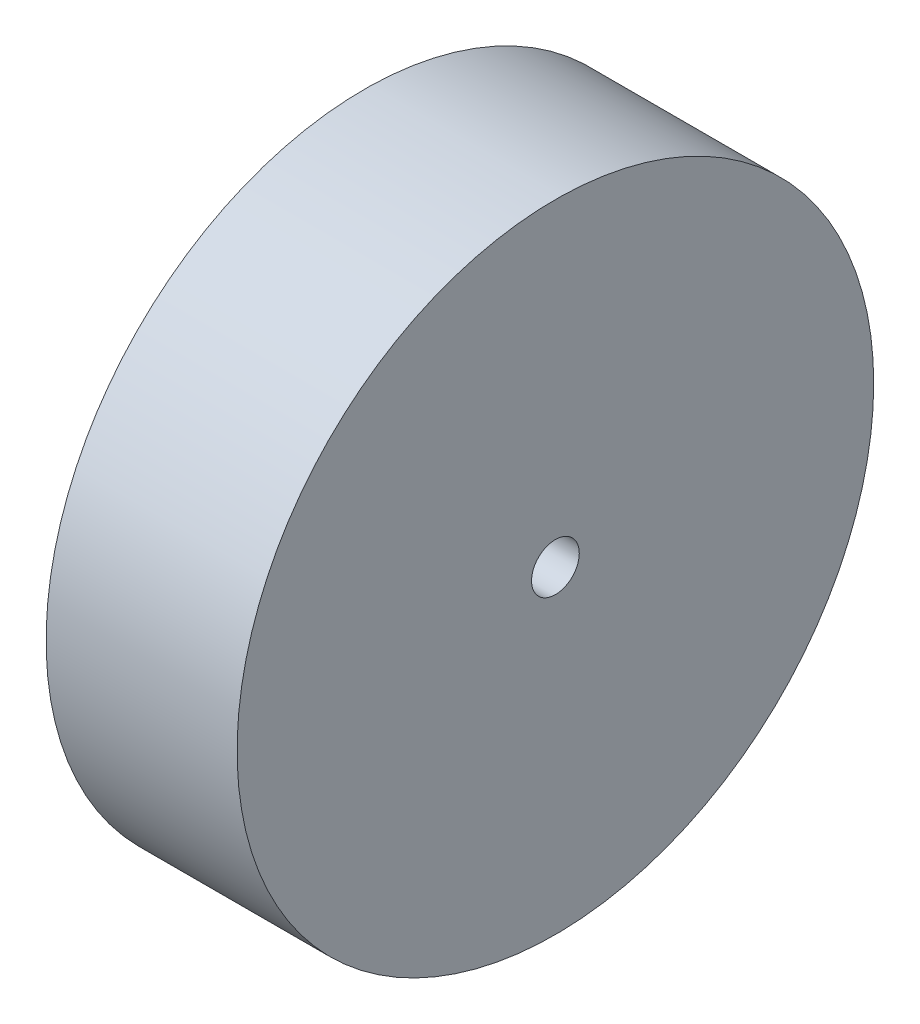
ISO-10303-21;
HEADER;
FILE_DESCRIPTION(('STEP AP214'),'2;1');
FILE_NAME('part.step','',(''),(''),'','','');
FILE_SCHEMA(('AUTOMOTIVE_DESIGN { 1 0 10303 214 1 1 1 1 }'));
ENDSEC;
DATA;
#1=APPLICATION_CONTEXT('core data for automotive mechanical design processes');
#2=APPLICATION_PROTOCOL_DEFINITION('international standard','automotive_design',2000,#1);
#3=PRODUCT_CONTEXT('',#1,'mechanical');
#4=PRODUCT('Part','Part','',(#3));
#5=PRODUCT_RELATED_PRODUCT_CATEGORY('part','',(#4));
#6=PRODUCT_DEFINITION_FORMATION('','',#4);
#7=PRODUCT_DEFINITION_CONTEXT('part definition',#1,'design');
#8=PRODUCT_DEFINITION('design','',#6,#7);
#9=PRODUCT_DEFINITION_SHAPE('','',#8);
#10=(LENGTH_UNIT() NAMED_UNIT(*) SI_UNIT(.MILLI.,.METRE.));
#11=(NAMED_UNIT(*) PLANE_ANGLE_UNIT() SI_UNIT($,.RADIAN.));
#12=(NAMED_UNIT(*) SI_UNIT($,.STERADIAN.) SOLID_ANGLE_UNIT());
#13=UNCERTAINTY_MEASURE_WITH_UNIT(LENGTH_MEASURE(1.E-05),#10,'distance_accuracy_value','');
#14=(GEOMETRIC_REPRESENTATION_CONTEXT(3) GLOBAL_UNCERTAINTY_ASSIGNED_CONTEXT((#13)) GLOBAL_UNIT_ASSIGNED_CONTEXT((#10,
#11,#12)) REPRESENTATION_CONTEXT('',''));
#15=CARTESIAN_POINT('',(0.,0.,0.));
#16=DIRECTION('',(0.,0.,1.));
#17=DIRECTION('',(1.,0.,0.));
#18=AXIS2_PLACEMENT_3D('',#15,#16,#17);
#19=CARTESIAN_POINT('',(0.,0.,0.));
#20=DIRECTION('',(1.,0.,0.));
#21=DIRECTION('',(0.,0.,-1.));
#22=AXIS2_PLACEMENT_3D('',#19,#20,#21);
#23=CYLINDRICAL_SURFACE('',#22,0.749999999999998);
#24=CARTESIAN_POINT('',(0.,0.,0.));
#25=DIRECTION('',(1.,0.,0.));
#26=DIRECTION('',(0.,0.,-1.));
#27=AXIS2_PLACEMENT_3D('',#24,#25,#26);
#28=CIRCLE('',#27,0.749999999999999);
#29=CARTESIAN_POINT('',(0.,0.,-0.749999999999999));
#30=VERTEX_POINT('',#29);
#31=EDGE_CURVE('E58',#30,#30,#28,.T.);
#32=ORIENTED_EDGE('',*,*,#31,.T.);
#33=EDGE_LOOP('',(#32));
#34=FACE_BOUND('',#33,.T.);
#35=CARTESIAN_POINT('',(-5.,0.,0.));
#36=DIRECTION('',(1.,0.,0.));
#37=DIRECTION('',(0.,0.,-1.));
#38=AXIS2_PLACEMENT_3D('',#35,#36,#37);
#39=CIRCLE('',#38,0.749999999999998);
#40=CARTESIAN_POINT('',(-5.,0.,-0.749999999999998));
#41=VERTEX_POINT('',#40);
#42=EDGE_CURVE('E10',#41,#41,#39,.T.);
#43=ORIENTED_EDGE('',*,*,#42,.F.);
#44=EDGE_LOOP('',(#43));
#45=FACE_BOUND('',#44,.T.);
#46=ADVANCED_FACE('F30',(#34,#45),#23,.F.);
#47=CARTESIAN_POINT('',(-5.,0.,0.));
#48=DIRECTION('',(1.,0.,0.));
#49=DIRECTION('',(0.,0.,-1.));
#50=AXIS2_PLACEMENT_3D('',#47,#48,#49);
#51=PLANE('',#50);
#52=ORIENTED_EDGE('',*,*,#42,.T.);
#53=EDGE_LOOP('',(#52));
#54=FACE_BOUND('',#53,.T.);
#55=ADVANCED_FACE('F76',(#54),#51,.T.);
#56=CARTESIAN_POINT('',(-6.,2.,0.));
#57=DIRECTION('',(-1.,0.,0.));
#58=DIRECTION('',(0.,0.,1.));
#59=AXIS2_PLACEMENT_3D('',#56,#57,#58);
#60=PLANE('',#59);
#61=CARTESIAN_POINT('',(-6.,0.,0.));
#62=DIRECTION('',(1.,0.,0.));
#63=DIRECTION('',(0.,0.,-1.));
#64=AXIS2_PLACEMENT_3D('',#61,#62,#63);
#65=CIRCLE('',#64,2.);
#66=CARTESIAN_POINT('',(-6.,0.,-2.));
#67=VERTEX_POINT('',#66);
#68=EDGE_CURVE('E36',#67,#67,#65,.T.);
#69=ORIENTED_EDGE('',*,*,#68,.F.);
#70=EDGE_LOOP('',(#69));
#71=FACE_BOUND('',#70,.T.);
#72=ADVANCED_FACE('F80',(#71),#60,.T.);
#73=CARTESIAN_POINT('',(0.,0.,0.));
#74=DIRECTION('',(1.,0.,0.));
#75=DIRECTION('',(0.,0.,-1.));
#76=AXIS2_PLACEMENT_3D('',#73,#74,#75);
#77=CYLINDRICAL_SURFACE('',#76,2.);
#78=ORIENTED_EDGE('',*,*,#68,.T.);
#79=EDGE_LOOP('',(#78));
#80=FACE_BOUND('',#79,.T.);
#81=CARTESIAN_POINT('',(-0.999999999999998,0.,0.));
#82=DIRECTION('',(1.,0.,0.));
#83=DIRECTION('',(0.,0.,-1.));
#84=AXIS2_PLACEMENT_3D('',#81,#82,#83);
#85=CIRCLE('',#84,2.);
#86=CARTESIAN_POINT('',(-0.999999999999998,0.,-2.));
#87=VERTEX_POINT('',#86);
#88=EDGE_CURVE('E40',#87,#87,#85,.T.);
#89=ORIENTED_EDGE('',*,*,#88,.F.);
#90=EDGE_LOOP('',(#89));
#91=FACE_BOUND('',#90,.T.);
#92=ADVANCED_FACE('F84',(#80,#91),#77,.T.);
#93=CARTESIAN_POINT('',(-0.999999999999999,9.,0.));
#94=DIRECTION('',(-1.,0.,0.));
#95=DIRECTION('',(0.,0.,1.));
#96=AXIS2_PLACEMENT_3D('',#93,#94,#95);
#97=PLANE('',#96);
#98=ORIENTED_EDGE('',*,*,#88,.T.);
#99=EDGE_LOOP('',(#98));
#100=FACE_BOUND('',#99,.T.);
#101=CARTESIAN_POINT('',(-1.,0.,0.));
#102=DIRECTION('',(1.,0.,0.));
#103=DIRECTION('',(0.,0.,-1.));
#104=AXIS2_PLACEMENT_3D('',#101,#102,#103);
#105=CIRCLE('',#104,9.);
#106=CARTESIAN_POINT('',(-1.,0.,-9.));
#107=VERTEX_POINT('',#106);
#108=EDGE_CURVE('E44',#107,#107,#105,.T.);
#109=ORIENTED_EDGE('',*,*,#108,.F.);
#110=EDGE_LOOP('',(#109));
#111=FACE_BOUND('',#110,.T.);
#112=ADVANCED_FACE('F90',(#100,#111),#97,.T.);
#113=CARTESIAN_POINT('',(0.,0.,0.));
#114=DIRECTION('',(1.,0.,0.));
#115=DIRECTION('',(0.,0.,-1.));
#116=AXIS2_PLACEMENT_3D('',#113,#114,#115);
#117=CYLINDRICAL_SURFACE('',#116,9.);
#118=ORIENTED_EDGE('',*,*,#108,.T.);
#119=EDGE_LOOP('',(#118));
#120=FACE_BOUND('',#119,.T.);
#121=CARTESIAN_POINT('',(-6.,0.,0.));
#122=DIRECTION('',(1.,0.,0.));
#123=DIRECTION('',(0.,0.,-1.));
#124=AXIS2_PLACEMENT_3D('',#121,#122,#123);
#125=CIRCLE('',#124,9.);
#126=CARTESIAN_POINT('',(-6.,0.,-9.));
#127=VERTEX_POINT('',#126);
#128=EDGE_CURVE('E49',#127,#127,#125,.T.);
#129=ORIENTED_EDGE('',*,*,#128,.F.);
#130=EDGE_LOOP('',(#129));
#131=FACE_BOUND('',#130,.T.);
#132=ADVANCED_FACE('F93',(#120,#131),#117,.F.);
#133=CARTESIAN_POINT('',(-6.,9.,0.));
#134=DIRECTION('',(-1.,0.,0.));
#135=DIRECTION('',(0.,0.,1.));
#136=AXIS2_PLACEMENT_3D('',#133,#134,#135);
#137=PLANE('',#136);
#138=ORIENTED_EDGE('',*,*,#128,.T.);
#139=EDGE_LOOP('',(#138));
#140=FACE_BOUND('',#139,.T.);
#141=CARTESIAN_POINT('',(-6.,0.,0.));
#142=DIRECTION('',(1.,0.,0.));
#143=DIRECTION('',(0.,0.,-1.));
#144=AXIS2_PLACEMENT_3D('',#141,#142,#143);
#145=CIRCLE('',#144,10.);
#146=CARTESIAN_POINT('',(-6.,0.,-10.));
#147=VERTEX_POINT('',#146);
#148=EDGE_CURVE('E52',#147,#147,#145,.T.);
#149=ORIENTED_EDGE('',*,*,#148,.F.);
#150=EDGE_LOOP('',(#149));
#151=FACE_BOUND('',#150,.T.);
#152=ADVANCED_FACE('F72',(#140,#151),#137,.T.);
#153=CARTESIAN_POINT('',(0.,0.,0.));
#154=DIRECTION('',(1.,0.,0.));
#155=DIRECTION('',(0.,0.,-1.));
#156=AXIS2_PLACEMENT_3D('',#153,#154,#155);
#157=CYLINDRICAL_SURFACE('',#156,10.);
#158=ORIENTED_EDGE('',*,*,#148,.T.);
#159=EDGE_LOOP('',(#158));
#160=FACE_BOUND('',#159,.T.);
#161=CARTESIAN_POINT('',(0.,0.,0.));
#162=DIRECTION('',(1.,0.,0.));
#163=DIRECTION('',(0.,0.,-1.));
#164=AXIS2_PLACEMENT_3D('',#161,#162,#163);
#165=CIRCLE('',#164,10.);
#166=CARTESIAN_POINT('',(0.,0.,-10.));
#167=VERTEX_POINT('',#166);
#168=EDGE_CURVE('E55',#167,#167,#165,.T.);
#169=ORIENTED_EDGE('',*,*,#168,.F.);
#170=EDGE_LOOP('',(#169));
#171=FACE_BOUND('',#170,.T.);
#172=ADVANCED_FACE('F66',(#160,#171),#157,.T.);
#173=CARTESIAN_POINT('',(0.,10.,0.));
#174=DIRECTION('',(1.,0.,0.));
#175=DIRECTION('',(0.,0.,-1.));
#176=AXIS2_PLACEMENT_3D('',#173,#174,#175);
#177=PLANE('',#176);
#178=ORIENTED_EDGE('',*,*,#168,.T.);
#179=EDGE_LOOP('',(#178));
#180=FACE_BOUND('',#179,.T.);
#181=ORIENTED_EDGE('',*,*,#31,.F.);
#182=EDGE_LOOP('',(#181));
#183=FACE_BOUND('',#182,.T.);
#184=ADVANCED_FACE('F64',(#180,#183),#177,.T.);
#185=CLOSED_SHELL('',(#46,#55,#72,#92,#112,#132,#152,#172,#184));
#186=MANIFOLD_SOLID_BREP('B2',#185);
#187=ADVANCED_BREP_SHAPE_REPRESENTATION('',(#18,#186),#14);
#188=SHAPE_DEFINITION_REPRESENTATION(#9,#187);
ENDSEC;
END-ISO-10303-21;
